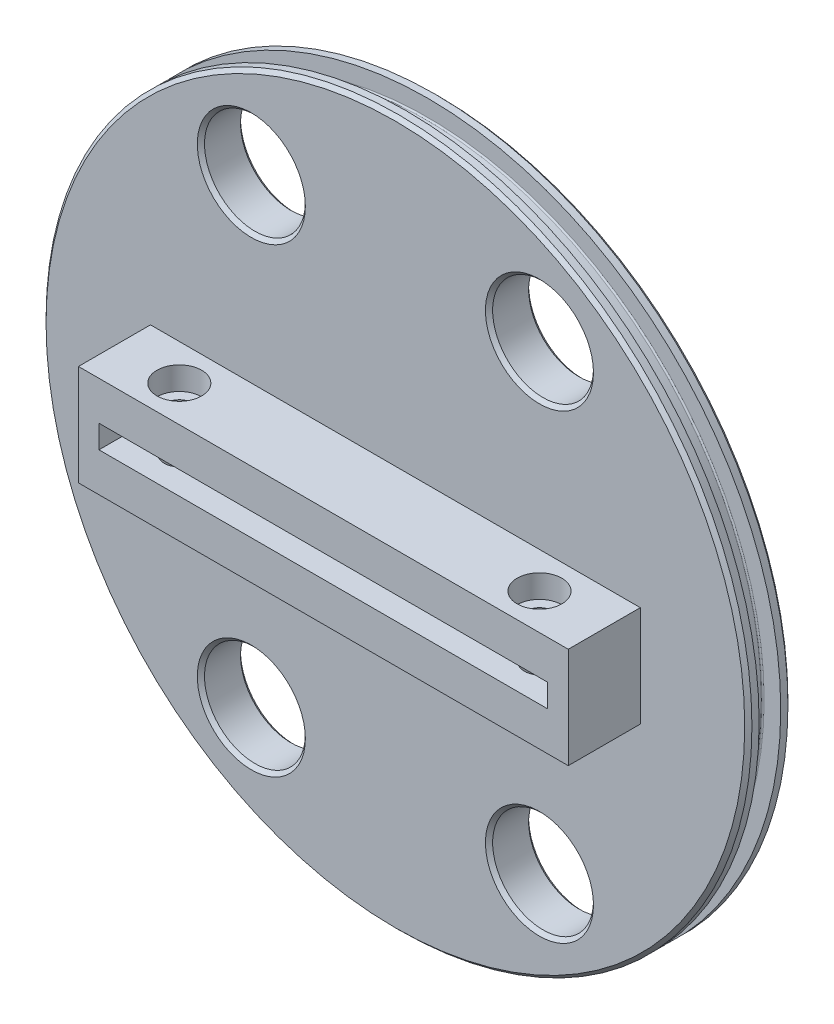
ISO-10303-21;
HEADER;
FILE_DESCRIPTION(('STEP AP214'),'2;1');
FILE_NAME('part.step','',(''),(''),'','','');
FILE_SCHEMA(('AUTOMOTIVE_DESIGN { 1 0 10303 214 1 1 1 1 }'));
ENDSEC;
DATA;
#1=APPLICATION_CONTEXT('core data for automotive mechanical design processes');
#2=APPLICATION_PROTOCOL_DEFINITION('international standard','automotive_design',2000,#1);
#3=PRODUCT_CONTEXT('',#1,'mechanical');
#4=PRODUCT('Part','Part','',(#3));
#5=PRODUCT_RELATED_PRODUCT_CATEGORY('part','',(#4));
#6=PRODUCT_DEFINITION_FORMATION('','',#4);
#7=PRODUCT_DEFINITION_CONTEXT('part definition',#1,'design');
#8=PRODUCT_DEFINITION('design','',#6,#7);
#9=PRODUCT_DEFINITION_SHAPE('','',#8);
#10=(LENGTH_UNIT() NAMED_UNIT(*) SI_UNIT(.MILLI.,.METRE.));
#11=(NAMED_UNIT(*) PLANE_ANGLE_UNIT() SI_UNIT($,.RADIAN.));
#12=(NAMED_UNIT(*) SI_UNIT($,.STERADIAN.) SOLID_ANGLE_UNIT());
#13=UNCERTAINTY_MEASURE_WITH_UNIT(LENGTH_MEASURE(1.E-05),#10,'distance_accuracy_value','');
#14=(GEOMETRIC_REPRESENTATION_CONTEXT(3) GLOBAL_UNCERTAINTY_ASSIGNED_CONTEXT((#13)) GLOBAL_UNIT_ASSIGNED_CONTEXT((#10,
#11,#12)) REPRESENTATION_CONTEXT('',''));
#15=CARTESIAN_POINT('',(0.,0.,0.));
#16=DIRECTION('',(0.,0.,1.));
#17=DIRECTION('',(1.,0.,0.));
#18=AXIS2_PLACEMENT_3D('',#15,#16,#17);
#19=CARTESIAN_POINT('',(-34.,7.,16.));
#20=DIRECTION('',(0.,-1.,0.));
#21=DIRECTION('',(0.,0.,-1.));
#22=AXIS2_PLACEMENT_3D('',#19,#20,#21);
#23=PLANE('',#22);
#24=DIRECTION('',(-1.,0.,0.));
#25=VECTOR('',#24,1.);
#26=CARTESIAN_POINT('',(-34.,7.,6.));
#27=LINE('',#26,#25);
#28=CARTESIAN_POINT('',(34.,7.,6.));
#29=VERTEX_POINT('',#28);
#30=CARTESIAN_POINT('',(-34.,7.,6.));
#31=VERTEX_POINT('',#30);
#32=EDGE_CURVE('E163',#29,#31,#27,.T.);
#33=ORIENTED_EDGE('',*,*,#32,.T.);
#34=DIRECTION('',(0.,0.,-1.));
#35=VECTOR('',#34,1.);
#36=CARTESIAN_POINT('',(-34.,7.,16.));
#37=LINE('',#36,#35);
#38=CARTESIAN_POINT('',(-34.,7.,16.));
#39=VERTEX_POINT('',#38);
#40=EDGE_CURVE('E175',#39,#31,#37,.T.);
#41=ORIENTED_EDGE('',*,*,#40,.F.);
#42=DIRECTION('',(-1.,0.,0.));
#43=VECTOR('',#42,1.);
#44=CARTESIAN_POINT('',(-34.,7.,16.));
#45=LINE('',#44,#43);
#46=CARTESIAN_POINT('',(34.,7.,16.));
#47=VERTEX_POINT('',#46);
#48=EDGE_CURVE('E154',#47,#39,#45,.T.);
#49=ORIENTED_EDGE('',*,*,#48,.F.);
#50=DIRECTION('',(0.,0.,-1.));
#51=VECTOR('',#50,1.);
#52=CARTESIAN_POINT('',(34.,7.,16.));
#53=LINE('',#52,#51);
#54=EDGE_CURVE('E178',#47,#29,#53,.T.);
#55=ORIENTED_EDGE('',*,*,#54,.T.);
#56=EDGE_LOOP('',(#33,#41,#49,#55));
#57=FACE_BOUND('',#56,.T.);
#58=CARTESIAN_POINT('',(25.,7.,11.));
#59=DIRECTION('',(0.,1.,0.));
#60=DIRECTION('',(0.,0.,1.));
#61=AXIS2_PLACEMENT_3D('',#58,#59,#60);
#62=CIRCLE('',#61,3.1);
#63=CARTESIAN_POINT('',(25.,7.,14.1));
#64=VERTEX_POINT('',#63);
#65=EDGE_CURVE('E489',#64,#64,#62,.T.);
#66=ORIENTED_EDGE('',*,*,#65,.F.);
#67=EDGE_LOOP('',(#66));
#68=FACE_BOUND('',#67,.T.);
#69=CARTESIAN_POINT('',(-25.,7.,11.));
#70=DIRECTION('',(0.,1.,0.));
#71=DIRECTION('',(0.,0.,1.));
#72=AXIS2_PLACEMENT_3D('',#69,#70,#71);
#73=CIRCLE('',#72,3.1);
#74=CARTESIAN_POINT('',(-25.,7.,14.1));
#75=VERTEX_POINT('',#74);
#76=EDGE_CURVE('E479',#75,#75,#73,.T.);
#77=ORIENTED_EDGE('',*,*,#76,.F.);
#78=EDGE_LOOP('',(#77));
#79=FACE_BOUND('',#78,.T.);
#80=ADVANCED_FACE('F43',(#57,#68,#79),#23,.F.);
#81=CARTESIAN_POINT('',(0.,0.,6.));
#82=DIRECTION('',(0.,0.,-1.));
#83=DIRECTION('',(-1.,0.,0.));
#84=AXIS2_PLACEMENT_3D('',#81,#82,#83);
#85=CYLINDRICAL_SURFACE('',#84,49.);
#86=CARTESIAN_POINT('',(0.,0.,5.49999999999997));
#87=DIRECTION('',(0.,0.,1.));
#88=DIRECTION('',(1.,0.,0.));
#89=AXIS2_PLACEMENT_3D('',#86,#87,#88);
#90=CIRCLE('',#89,49.);
#91=CARTESIAN_POINT('',(49.,0.,5.49999999999997));
#92=VERTEX_POINT('',#91);
#93=EDGE_CURVE('E11',#92,#92,#90,.F.);
#94=ORIENTED_EDGE('',*,*,#93,.T.);
#95=EDGE_LOOP('',(#94));
#96=FACE_BOUND('',#95,.T.);
#97=CARTESIAN_POINT('',(0.,0.,4.5));
#98=DIRECTION('',(0.,0.,-1.));
#99=DIRECTION('',(-1.,0.,0.));
#100=AXIS2_PLACEMENT_3D('',#97,#98,#99);
#101=CIRCLE('',#100,49.);
#102=CARTESIAN_POINT('',(-49.,0.,4.5));
#103=VERTEX_POINT('',#102);
#104=EDGE_CURVE('E182',#103,#103,#101,.T.);
#105=ORIENTED_EDGE('',*,*,#104,.F.);
#106=EDGE_LOOP('',(#105));
#107=FACE_BOUND('',#106,.T.);
#108=ADVANCED_FACE('F273',(#96,#107),#85,.T.);
#109=CARTESIAN_POINT('',(0.,0.,6.));
#110=DIRECTION('',(0.,0.,1.));
#111=DIRECTION('',(1.,0.,0.));
#112=AXIS2_PLACEMENT_3D('',#109,#110,#111);
#113=PLANE('',#112);
#114=CARTESIAN_POINT('',(20.,-32.,6.));
#115=DIRECTION('',(0.,0.,1.));
#116=DIRECTION('',(1.,0.,0.));
#117=AXIS2_PLACEMENT_3D('',#114,#115,#116);
#118=CIRCLE('',#117,7.49999999999999);
#119=CARTESIAN_POINT('',(27.5,-32.,6.));
#120=VERTEX_POINT('',#119);
#121=EDGE_CURVE('E211',#120,#120,#118,.F.);
#122=ORIENTED_EDGE('',*,*,#121,.T.);
#123=EDGE_LOOP('',(#122));
#124=FACE_BOUND('',#123,.T.);
#125=CARTESIAN_POINT('',(-20.,-32.,6.));
#126=DIRECTION('',(0.,0.,1.));
#127=DIRECTION('',(1.,0.,0.));
#128=AXIS2_PLACEMENT_3D('',#125,#126,#127);
#129=CIRCLE('',#128,7.50000000000003);
#130=CARTESIAN_POINT('',(-12.5,-32.,6.));
#131=VERTEX_POINT('',#130);
#132=EDGE_CURVE('E208',#131,#131,#129,.F.);
#133=ORIENTED_EDGE('',*,*,#132,.T.);
#134=EDGE_LOOP('',(#133));
#135=FACE_BOUND('',#134,.T.);
#136=CARTESIAN_POINT('',(-20.,32.,6.));
#137=DIRECTION('',(0.,0.,1.));
#138=DIRECTION('',(1.,0.,0.));
#139=AXIS2_PLACEMENT_3D('',#136,#137,#138);
#140=CIRCLE('',#139,7.50000000000003);
#141=CARTESIAN_POINT('',(-12.5,32.,6.));
#142=VERTEX_POINT('',#141);
#143=EDGE_CURVE('E205',#142,#142,#140,.F.);
#144=ORIENTED_EDGE('',*,*,#143,.T.);
#145=EDGE_LOOP('',(#144));
#146=FACE_BOUND('',#145,.T.);
#147=CARTESIAN_POINT('',(20.,32.,6.));
#148=DIRECTION('',(0.,0.,1.));
#149=DIRECTION('',(1.,0.,0.));
#150=AXIS2_PLACEMENT_3D('',#147,#148,#149);
#151=CIRCLE('',#150,7.49999999999999);
#152=CARTESIAN_POINT('',(27.5,32.,6.));
#153=VERTEX_POINT('',#152);
#154=EDGE_CURVE('E202',#153,#153,#151,.F.);
#155=ORIENTED_EDGE('',*,*,#154,.T.);
#156=EDGE_LOOP('',(#155));
#157=FACE_BOUND('',#156,.T.);
#158=CARTESIAN_POINT('',(0.,0.,6.));
#159=DIRECTION('',(0.,0.,1.));
#160=DIRECTION('',(1.,0.,0.));
#161=AXIS2_PLACEMENT_3D('',#158,#159,#160);
#162=CIRCLE('',#161,48.5);
#163=CARTESIAN_POINT('',(48.5,0.,6.));
#164=VERTEX_POINT('',#163);
#165=EDGE_CURVE('E199',#164,#164,#162,.T.);
#166=ORIENTED_EDGE('',*,*,#165,.T.);
#167=EDGE_LOOP('',(#166));
#168=FACE_BOUND('',#167,.T.);
#169=DIRECTION('',(0.,1.,0.));
#170=VECTOR('',#169,1.);
#171=CARTESIAN_POINT('',(34.,7.,6.));
#172=LINE('',#171,#170);
#173=CARTESIAN_POINT('',(34.,-7.,6.));
#174=VERTEX_POINT('',#173);
#175=EDGE_CURVE('E67',#174,#29,#172,.T.);
#176=ORIENTED_EDGE('',*,*,#175,.F.);
#177=DIRECTION('',(1.,0.,0.));
#178=VECTOR('',#177,1.);
#179=CARTESIAN_POINT('',(-34.,-7.,6.));
#180=LINE('',#179,#178);
#181=CARTESIAN_POINT('',(-34.,-7.,6.));
#182=VERTEX_POINT('',#181);
#183=EDGE_CURVE('E155',#182,#174,#180,.T.);
#184=ORIENTED_EDGE('',*,*,#183,.F.);
#185=DIRECTION('',(0.,-1.,0.));
#186=VECTOR('',#185,1.);
#187=CARTESIAN_POINT('',(-34.,7.,6.));
#188=LINE('',#187,#186);
#189=EDGE_CURVE('E166',#31,#182,#188,.T.);
#190=ORIENTED_EDGE('',*,*,#189,.F.);
#191=ORIENTED_EDGE('',*,*,#32,.F.);
#192=EDGE_LOOP('',(#176,#184,#190,#191));
#193=FACE_BOUND('',#192,.T.);
#194=ADVANCED_FACE('F281',(#124,#135,#146,#157,#168,#193),#113,.T.);
#195=CARTESIAN_POINT('',(34.,7.,16.));
#196=DIRECTION('',(-1.,0.,0.));
#197=DIRECTION('',(0.,0.,1.));
#198=AXIS2_PLACEMENT_3D('',#195,#196,#197);
#199=PLANE('',#198);
#200=ORIENTED_EDGE('',*,*,#175,.T.);
#201=ORIENTED_EDGE('',*,*,#54,.F.);
#202=DIRECTION('',(0.,1.,0.));
#203=VECTOR('',#202,1.);
#204=CARTESIAN_POINT('',(34.,7.,16.));
#205=LINE('',#204,#203);
#206=CARTESIAN_POINT('',(34.,-7.,16.));
#207=VERTEX_POINT('',#206);
#208=EDGE_CURVE('E151',#207,#47,#205,.T.);
#209=ORIENTED_EDGE('',*,*,#208,.F.);
#210=DIRECTION('',(0.,0.,-1.));
#211=VECTOR('',#210,1.);
#212=CARTESIAN_POINT('',(34.,-7.,16.));
#213=LINE('',#212,#211);
#214=EDGE_CURVE('E161',#207,#174,#213,.T.);
#215=ORIENTED_EDGE('',*,*,#214,.T.);
#216=EDGE_LOOP('',(#200,#201,#209,#215));
#217=FACE_BOUND('',#216,.T.);
#218=ADVANCED_FACE('F289',(#217),#199,.F.);
#219=CARTESIAN_POINT('',(-34.,7.,16.));
#220=DIRECTION('',(1.,0.,0.));
#221=DIRECTION('',(0.,0.,-1.));
#222=AXIS2_PLACEMENT_3D('',#219,#220,#221);
#223=PLANE('',#222);
#224=ORIENTED_EDGE('',*,*,#189,.T.);
#225=DIRECTION('',(0.,0.,-1.));
#226=VECTOR('',#225,1.);
#227=CARTESIAN_POINT('',(-34.,-7.,16.));
#228=LINE('',#227,#226);
#229=CARTESIAN_POINT('',(-34.,-7.,16.));
#230=VERTEX_POINT('',#229);
#231=EDGE_CURVE('E172',#230,#182,#228,.T.);
#232=ORIENTED_EDGE('',*,*,#231,.F.);
#233=DIRECTION('',(0.,-1.,0.));
#234=VECTOR('',#233,1.);
#235=CARTESIAN_POINT('',(-34.,7.,16.));
#236=LINE('',#235,#234);
#237=EDGE_CURVE('E157',#39,#230,#236,.T.);
#238=ORIENTED_EDGE('',*,*,#237,.F.);
#239=ORIENTED_EDGE('',*,*,#40,.T.);
#240=EDGE_LOOP('',(#224,#232,#238,#239));
#241=FACE_BOUND('',#240,.T.);
#242=ADVANCED_FACE('F287',(#241),#223,.F.);
#243=CARTESIAN_POINT('',(-34.,-7.,16.));
#244=DIRECTION('',(0.,1.,0.));
#245=DIRECTION('',(0.,0.,1.));
#246=AXIS2_PLACEMENT_3D('',#243,#244,#245);
#247=PLANE('',#246);
#248=CARTESIAN_POINT('',(-25.,-7.,11.));
#249=DIRECTION('',(0.,1.,0.));
#250=DIRECTION('',(0.,0.,1.));
#251=AXIS2_PLACEMENT_3D('',#248,#249,#250);
#252=CIRCLE('',#251,2.1);
#253=CARTESIAN_POINT('',(-25.,-7.,13.1));
#254=VERTEX_POINT('',#253);
#255=EDGE_CURVE('E463',#254,#254,#252,.T.);
#256=ORIENTED_EDGE('',*,*,#255,.T.);
#257=EDGE_LOOP('',(#256));
#258=FACE_BOUND('',#257,.T.);
#259=CARTESIAN_POINT('',(25.,-7.,11.));
#260=DIRECTION('',(0.,1.,0.));
#261=DIRECTION('',(0.,0.,1.));
#262=AXIS2_PLACEMENT_3D('',#259,#260,#261);
#263=CIRCLE('',#262,2.1);
#264=CARTESIAN_POINT('',(25.,-7.,13.1));
#265=VERTEX_POINT('',#264);
#266=EDGE_CURVE('E467',#265,#265,#263,.T.);
#267=ORIENTED_EDGE('',*,*,#266,.T.);
#268=EDGE_LOOP('',(#267));
#269=FACE_BOUND('',#268,.T.);
#270=ORIENTED_EDGE('',*,*,#183,.T.);
#271=ORIENTED_EDGE('',*,*,#214,.F.);
#272=DIRECTION('',(1.,0.,0.));
#273=VECTOR('',#272,1.);
#274=CARTESIAN_POINT('',(-34.,-7.,16.));
#275=LINE('',#274,#273);
#276=EDGE_CURVE('E159',#230,#207,#275,.T.);
#277=ORIENTED_EDGE('',*,*,#276,.F.);
#278=ORIENTED_EDGE('',*,*,#231,.T.);
#279=EDGE_LOOP('',(#270,#271,#277,#278));
#280=FACE_BOUND('',#279,.T.);
#281=ADVANCED_FACE('F452',(#258,#269,#280),#247,.F.);
#282=CARTESIAN_POINT('',(0.,0.,16.));
#283=DIRECTION('',(0.,0.,1.));
#284=DIRECTION('',(1.,0.,0.));
#285=AXIS2_PLACEMENT_3D('',#282,#283,#284);
#286=PLANE('',#285);
#287=DIRECTION('',(0.,1.,0.));
#288=VECTOR('',#287,1.);
#289=CARTESIAN_POINT('',(31.15,1.6,16.));
#290=LINE('',#289,#288);
#291=CARTESIAN_POINT('',(31.15,-1.6,16.));
#292=VERTEX_POINT('',#291);
#293=CARTESIAN_POINT('',(31.15,1.6,16.));
#294=VERTEX_POINT('',#293);
#295=EDGE_CURVE('E59',#292,#294,#290,.T.);
#296=ORIENTED_EDGE('',*,*,#295,.F.);
#297=DIRECTION('',(1.,0.,0.));
#298=VECTOR('',#297,1.);
#299=CARTESIAN_POINT('',(-31.15,-1.6,16.));
#300=LINE('',#299,#298);
#301=CARTESIAN_POINT('',(-31.15,-1.6,16.));
#302=VERTEX_POINT('',#301);
#303=EDGE_CURVE('E129',#302,#292,#300,.T.);
#304=ORIENTED_EDGE('',*,*,#303,.F.);
#305=DIRECTION('',(0.,-1.,0.));
#306=VECTOR('',#305,1.);
#307=CARTESIAN_POINT('',(-31.15,1.6,16.));
#308=LINE('',#307,#306);
#309=CARTESIAN_POINT('',(-31.15,1.6,16.));
#310=VERTEX_POINT('',#309);
#311=EDGE_CURVE('E132',#310,#302,#308,.T.);
#312=ORIENTED_EDGE('',*,*,#311,.F.);
#313=DIRECTION('',(-1.,0.,0.));
#314=VECTOR('',#313,1.);
#315=CARTESIAN_POINT('',(-31.15,1.6,16.));
#316=LINE('',#315,#314);
#317=EDGE_CURVE('E141',#294,#310,#316,.T.);
#318=ORIENTED_EDGE('',*,*,#317,.F.);
#319=EDGE_LOOP('',(#296,#304,#312,#318));
#320=FACE_BOUND('',#319,.T.);
#321=ORIENTED_EDGE('',*,*,#208,.T.);
#322=ORIENTED_EDGE('',*,*,#48,.T.);
#323=ORIENTED_EDGE('',*,*,#237,.T.);
#324=ORIENTED_EDGE('',*,*,#276,.T.);
#325=EDGE_LOOP('',(#321,#322,#323,#324));
#326=FACE_BOUND('',#325,.T.);
#327=ADVANCED_FACE('F450',(#320,#326),#286,.T.);
#328=CARTESIAN_POINT('',(31.15,1.6,6.));
#329=DIRECTION('',(1.,0.,0.));
#330=DIRECTION('',(0.,0.,-1.));
#331=AXIS2_PLACEMENT_3D('',#328,#329,#330);
#332=PLANE('',#331);
#333=ORIENTED_EDGE('',*,*,#295,.T.);
#334=DIRECTION('',(0.,0.,1.));
#335=VECTOR('',#334,1.);
#336=CARTESIAN_POINT('',(31.15,1.6,6.));
#337=LINE('',#336,#335);
#338=CARTESIAN_POINT('',(31.15,1.6,6.));
#339=VERTEX_POINT('',#338);
#340=EDGE_CURVE('E107',#339,#294,#337,.T.);
#341=ORIENTED_EDGE('',*,*,#340,.F.);
#342=DIRECTION('',(0.,1.,0.));
#343=VECTOR('',#342,1.);
#344=CARTESIAN_POINT('',(31.15,1.6,6.));
#345=LINE('',#344,#343);
#346=CARTESIAN_POINT('',(31.15,-1.6,6.));
#347=VERTEX_POINT('',#346);
#348=EDGE_CURVE('E111',#347,#339,#345,.T.);
#349=ORIENTED_EDGE('',*,*,#348,.F.);
#350=DIRECTION('',(0.,0.,1.));
#351=VECTOR('',#350,1.);
#352=CARTESIAN_POINT('',(31.15,-1.6,6.));
#353=LINE('',#352,#351);
#354=EDGE_CURVE('E146',#347,#292,#353,.T.);
#355=ORIENTED_EDGE('',*,*,#354,.T.);
#356=EDGE_LOOP('',(#333,#341,#349,#355));
#357=FACE_BOUND('',#356,.T.);
#358=ADVANCED_FACE('F109',(#357),#332,.F.);
#359=CARTESIAN_POINT('',(-31.15,-1.6,6.));
#360=DIRECTION('',(0.,-1.,0.));
#361=DIRECTION('',(0.,0.,-1.));
#362=AXIS2_PLACEMENT_3D('',#359,#360,#361);
#363=PLANE('',#362);
#364=CARTESIAN_POINT('',(-25.,-1.6,11.));
#365=DIRECTION('',(0.,1.,0.));
#366=DIRECTION('',(0.,0.,1.));
#367=AXIS2_PLACEMENT_3D('',#364,#365,#366);
#368=CIRCLE('',#367,2.1);
#369=CARTESIAN_POINT('',(-25.,-1.6,13.1));
#370=VERTEX_POINT('',#369);
#371=EDGE_CURVE('E477',#370,#370,#368,.T.);
#372=ORIENTED_EDGE('',*,*,#371,.F.);
#373=EDGE_LOOP('',(#372));
#374=FACE_BOUND('',#373,.T.);
#375=CARTESIAN_POINT('',(25.,-1.6,11.));
#376=DIRECTION('',(0.,1.,0.));
#377=DIRECTION('',(0.,0.,1.));
#378=AXIS2_PLACEMENT_3D('',#375,#376,#377);
#379=CIRCLE('',#378,2.1);
#380=CARTESIAN_POINT('',(25.,-1.6,13.1));
#381=VERTEX_POINT('',#380);
#382=EDGE_CURVE('E482',#381,#381,#379,.T.);
#383=ORIENTED_EDGE('',*,*,#382,.F.);
#384=EDGE_LOOP('',(#383));
#385=FACE_BOUND('',#384,.T.);
#386=ORIENTED_EDGE('',*,*,#303,.T.);
#387=ORIENTED_EDGE('',*,*,#354,.F.);
#388=DIRECTION('',(1.,0.,0.));
#389=VECTOR('',#388,1.);
#390=CARTESIAN_POINT('',(-31.15,-1.6,6.));
#391=LINE('',#390,#389);
#392=CARTESIAN_POINT('',(-31.15,-1.6,6.));
#393=VERTEX_POINT('',#392);
#394=EDGE_CURVE('E117',#393,#347,#391,.T.);
#395=ORIENTED_EDGE('',*,*,#394,.F.);
#396=DIRECTION('',(0.,0.,1.));
#397=VECTOR('',#396,1.);
#398=CARTESIAN_POINT('',(-31.15,-1.6,6.));
#399=LINE('',#398,#397);
#400=EDGE_CURVE('E148',#393,#302,#399,.T.);
#401=ORIENTED_EDGE('',*,*,#400,.T.);
#402=EDGE_LOOP('',(#386,#387,#395,#401));
#403=FACE_BOUND('',#402,.T.);
#404=ADVANCED_FACE('F438',(#374,#385,#403),#363,.F.);
#405=CARTESIAN_POINT('',(-31.15,1.6,6.));
#406=DIRECTION('',(-1.,0.,0.));
#407=DIRECTION('',(0.,0.,1.));
#408=AXIS2_PLACEMENT_3D('',#405,#406,#407);
#409=PLANE('',#408);
#410=ORIENTED_EDGE('',*,*,#311,.T.);
#411=ORIENTED_EDGE('',*,*,#400,.F.);
#412=DIRECTION('',(0.,-1.,0.));
#413=VECTOR('',#412,1.);
#414=CARTESIAN_POINT('',(-31.15,1.6,6.));
#415=LINE('',#414,#413);
#416=CARTESIAN_POINT('',(-31.15,1.6,6.));
#417=VERTEX_POINT('',#416);
#418=EDGE_CURVE('E125',#417,#393,#415,.T.);
#419=ORIENTED_EDGE('',*,*,#418,.F.);
#420=DIRECTION('',(0.,0.,1.));
#421=VECTOR('',#420,1.);
#422=CARTESIAN_POINT('',(-31.15,1.6,6.));
#423=LINE('',#422,#421);
#424=EDGE_CURVE('E116',#417,#310,#423,.T.);
#425=ORIENTED_EDGE('',*,*,#424,.T.);
#426=EDGE_LOOP('',(#410,#411,#419,#425));
#427=FACE_BOUND('',#426,.T.);
#428=ADVANCED_FACE('F441',(#427),#409,.F.);
#429=CARTESIAN_POINT('',(-31.15,1.6,6.));
#430=DIRECTION('',(0.,1.,0.));
#431=DIRECTION('',(0.,0.,1.));
#432=AXIS2_PLACEMENT_3D('',#429,#430,#431);
#433=PLANE('',#432);
#434=CARTESIAN_POINT('',(-25.,1.6,11.));
#435=DIRECTION('',(0.,1.,0.));
#436=DIRECTION('',(0.,0.,1.));
#437=AXIS2_PLACEMENT_3D('',#434,#435,#436);
#438=CIRCLE('',#437,1.7);
#439=CARTESIAN_POINT('',(-25.,1.6,12.7));
#440=VERTEX_POINT('',#439);
#441=EDGE_CURVE('E486',#440,#440,#438,.F.);
#442=ORIENTED_EDGE('',*,*,#441,.F.);
#443=EDGE_LOOP('',(#442));
#444=FACE_BOUND('',#443,.T.);
#445=CARTESIAN_POINT('',(25.,1.6,11.));
#446=DIRECTION('',(0.,1.,0.));
#447=DIRECTION('',(0.,0.,1.));
#448=AXIS2_PLACEMENT_3D('',#445,#446,#447);
#449=CIRCLE('',#448,1.7);
#450=CARTESIAN_POINT('',(25.,1.6,12.7));
#451=VERTEX_POINT('',#450);
#452=EDGE_CURVE('E185',#451,#451,#449,.F.);
#453=ORIENTED_EDGE('',*,*,#452,.F.);
#454=EDGE_LOOP('',(#453));
#455=FACE_BOUND('',#454,.T.);
#456=ORIENTED_EDGE('',*,*,#317,.T.);
#457=ORIENTED_EDGE('',*,*,#424,.F.);
#458=DIRECTION('',(-1.,0.,0.));
#459=VECTOR('',#458,1.);
#460=CARTESIAN_POINT('',(-31.15,1.6,6.));
#461=LINE('',#460,#459);
#462=EDGE_CURVE('E120',#339,#417,#461,.T.);
#463=ORIENTED_EDGE('',*,*,#462,.F.);
#464=ORIENTED_EDGE('',*,*,#340,.T.);
#465=EDGE_LOOP('',(#456,#457,#463,#464));
#466=FACE_BOUND('',#465,.T.);
#467=ADVANCED_FACE('F121',(#444,#455,#466),#433,.F.);
#468=CARTESIAN_POINT('',(0.,0.,6.));
#469=DIRECTION('',(0.,0.,1.));
#470=DIRECTION('',(1.,0.,0.));
#471=AXIS2_PLACEMENT_3D('',#468,#469,#470);
#472=PLANE('',#471);
#473=ORIENTED_EDGE('',*,*,#348,.T.);
#474=ORIENTED_EDGE('',*,*,#462,.T.);
#475=ORIENTED_EDGE('',*,*,#418,.T.);
#476=ORIENTED_EDGE('',*,*,#394,.T.);
#477=EDGE_LOOP('',(#473,#474,#475,#476));
#478=FACE_BOUND('',#477,.T.);
#479=ADVANCED_FACE('F127',(#478),#472,.T.);
#480=CARTESIAN_POINT('',(0.,52.,1.5));
#481=DIRECTION('',(0.,0.,1.));
#482=DIRECTION('',(1.,0.,0.));
#483=AXIS2_PLACEMENT_3D('',#480,#481,#482);
#484=PLANE('',#483);
#485=CARTESIAN_POINT('',(0.,0.,1.5));
#486=DIRECTION('',(0.,0.,1.));
#487=DIRECTION('',(1.,0.,0.));
#488=AXIS2_PLACEMENT_3D('',#485,#486,#487);
#489=CIRCLE('',#488,46.7);
#490=CARTESIAN_POINT('',(46.7,0.,1.5));
#491=VERTEX_POINT('',#490);
#492=EDGE_CURVE('E193',#491,#491,#489,.F.);
#493=ORIENTED_EDGE('',*,*,#492,.T.);
#494=EDGE_LOOP('',(#493));
#495=FACE_BOUND('',#494,.T.);
#496=CARTESIAN_POINT('',(0.,0.,1.5));
#497=DIRECTION('',(0.,0.,1.));
#498=DIRECTION('',(1.,0.,0.));
#499=AXIS2_PLACEMENT_3D('',#496,#497,#498);
#500=CIRCLE('',#499,49.);
#501=CARTESIAN_POINT('',(49.,0.,1.5));
#502=VERTEX_POINT('',#501);
#503=EDGE_CURVE('E142',#502,#502,#500,.T.);
#504=ORIENTED_EDGE('',*,*,#503,.T.);
#505=EDGE_LOOP('',(#504));
#506=FACE_BOUND('',#505,.T.);
#507=ADVANCED_FACE('F431',(#495,#506),#484,.T.);
#508=CARTESIAN_POINT('',(0.,52.,4.5));
#509=DIRECTION('',(0.,0.,-1.));
#510=DIRECTION('',(-1.,0.,0.));
#511=AXIS2_PLACEMENT_3D('',#508,#509,#510);
#512=PLANE('',#511);
#513=CARTESIAN_POINT('',(0.,0.,4.5));
#514=DIRECTION('',(0.,0.,-1.));
#515=DIRECTION('',(-1.,0.,0.));
#516=AXIS2_PLACEMENT_3D('',#513,#514,#515);
#517=CIRCLE('',#516,46.7);
#518=CARTESIAN_POINT('',(-46.7,0.,4.5));
#519=VERTEX_POINT('',#518);
#520=EDGE_CURVE('E196',#519,#519,#517,.F.);
#521=ORIENTED_EDGE('',*,*,#520,.T.);
#522=EDGE_LOOP('',(#521));
#523=FACE_BOUND('',#522,.T.);
#524=ORIENTED_EDGE('',*,*,#104,.T.);
#525=EDGE_LOOP('',(#524));
#526=FACE_BOUND('',#525,.T.);
#527=ADVANCED_FACE('F427',(#523,#526),#512,.T.);
#528=CARTESIAN_POINT('',(0.,0.,6.));
#529=DIRECTION('',(0.,0.,1.));
#530=DIRECTION('',(1.,0.,0.));
#531=AXIS2_PLACEMENT_3D('',#528,#529,#530);
#532=CYLINDRICAL_SURFACE('',#531,46.5);
#533=CARTESIAN_POINT('',(0.,0.,1.7));
#534=DIRECTION('',(0.,0.,1.));
#535=DIRECTION('',(1.,0.,0.));
#536=AXIS2_PLACEMENT_3D('',#533,#534,#535);
#537=CIRCLE('',#536,46.5);
#538=CARTESIAN_POINT('',(46.5,0.,1.7));
#539=VERTEX_POINT('',#538);
#540=EDGE_CURVE('E190',#539,#539,#537,.T.);
#541=ORIENTED_EDGE('',*,*,#540,.T.);
#542=EDGE_LOOP('',(#541));
#543=FACE_BOUND('',#542,.T.);
#544=CARTESIAN_POINT('',(0.,0.,4.3));
#545=DIRECTION('',(0.,0.,-1.));
#546=DIRECTION('',(-1.,0.,0.));
#547=AXIS2_PLACEMENT_3D('',#544,#545,#546);
#548=CIRCLE('',#547,46.5);
#549=CARTESIAN_POINT('',(-46.5,0.,4.3));
#550=VERTEX_POINT('',#549);
#551=EDGE_CURVE('E181',#550,#550,#548,.T.);
#552=ORIENTED_EDGE('',*,*,#551,.T.);
#553=EDGE_LOOP('',(#552));
#554=FACE_BOUND('',#553,.T.);
#555=ADVANCED_FACE('F298',(#543,#554),#532,.T.);
#556=CARTESIAN_POINT('',(0.,0.,0.));
#557=DIRECTION('',(0.,0.,1.));
#558=DIRECTION('',(1.,0.,0.));
#559=AXIS2_PLACEMENT_3D('',#556,#557,#558);
#560=PLANE('',#559);
#561=CARTESIAN_POINT('',(20.,-32.,0.));
#562=DIRECTION('',(0.,0.,1.));
#563=DIRECTION('',(1.,0.,0.));
#564=AXIS2_PLACEMENT_3D('',#561,#562,#563);
#565=CIRCLE('',#564,7.50000000000002);
#566=CARTESIAN_POINT('',(27.5,-32.,0.));
#567=VERTEX_POINT('',#566);
#568=EDGE_CURVE('E232',#567,#567,#565,.T.);
#569=ORIENTED_EDGE('',*,*,#568,.T.);
#570=EDGE_LOOP('',(#569));
#571=FACE_BOUND('',#570,.T.);
#572=CARTESIAN_POINT('',(-20.,-32.,0.));
#573=DIRECTION('',(0.,0.,1.));
#574=DIRECTION('',(1.,0.,0.));
#575=AXIS2_PLACEMENT_3D('',#572,#573,#574);
#576=CIRCLE('',#575,7.50000000000002);
#577=CARTESIAN_POINT('',(-12.5,-32.,0.));
#578=VERTEX_POINT('',#577);
#579=EDGE_CURVE('E229',#578,#578,#576,.T.);
#580=ORIENTED_EDGE('',*,*,#579,.T.);
#581=EDGE_LOOP('',(#580));
#582=FACE_BOUND('',#581,.T.);
#583=CARTESIAN_POINT('',(-20.,32.,0.));
#584=DIRECTION('',(0.,0.,1.));
#585=DIRECTION('',(1.,0.,0.));
#586=AXIS2_PLACEMENT_3D('',#583,#584,#585);
#587=CIRCLE('',#586,7.49999999999998);
#588=CARTESIAN_POINT('',(-12.5,32.,0.));
#589=VERTEX_POINT('',#588);
#590=EDGE_CURVE('E226',#589,#589,#587,.T.);
#591=ORIENTED_EDGE('',*,*,#590,.T.);
#592=EDGE_LOOP('',(#591));
#593=FACE_BOUND('',#592,.T.);
#594=CARTESIAN_POINT('',(20.,32.,0.));
#595=DIRECTION('',(0.,0.,1.));
#596=DIRECTION('',(1.,0.,0.));
#597=AXIS2_PLACEMENT_3D('',#594,#595,#596);
#598=CIRCLE('',#597,7.49999999999998);
#599=CARTESIAN_POINT('',(27.5,32.,0.));
#600=VERTEX_POINT('',#599);
#601=EDGE_CURVE('E223',#600,#600,#598,.T.);
#602=ORIENTED_EDGE('',*,*,#601,.T.);
#603=EDGE_LOOP('',(#602));
#604=FACE_BOUND('',#603,.T.);
#605=CARTESIAN_POINT('',(0.,0.,0.));
#606=DIRECTION('',(0.,0.,1.));
#607=DIRECTION('',(1.,0.,0.));
#608=AXIS2_PLACEMENT_3D('',#605,#606,#607);
#609=CIRCLE('',#608,48.5);
#610=CARTESIAN_POINT('',(48.5,0.,0.));
#611=VERTEX_POINT('',#610);
#612=EDGE_CURVE('E220',#611,#611,#609,.F.);
#613=ORIENTED_EDGE('',*,*,#612,.T.);
#614=EDGE_LOOP('',(#613));
#615=FACE_BOUND('',#614,.T.);
#616=ADVANCED_FACE('F296',(#571,#582,#593,#604,#615),#560,.F.);
#617=CARTESIAN_POINT('',(0.,0.,0.500000000000007));
#618=DIRECTION('',(0.,0.,1.));
#619=DIRECTION('',(1.,0.,0.));
#620=AXIS2_PLACEMENT_3D('',#617,#618,#619);
#621=CIRCLE('',#620,49.);
#622=CARTESIAN_POINT('',(49.,0.,0.500000000000007));
#623=VERTEX_POINT('',#622);
#624=EDGE_CURVE('E52',#623,#623,#621,.T.);
#625=ORIENTED_EDGE('',*,*,#624,.T.);
#626=EDGE_LOOP('',(#625));
#627=FACE_BOUND('',#626,.T.);
#628=ORIENTED_EDGE('',*,*,#503,.F.);
#629=EDGE_LOOP('',(#628));
#630=FACE_BOUND('',#629,.T.);
#631=ADVANCED_FACE('F255',(#627,#630),#85,.T.);
#632=CARTESIAN_POINT('',(0.,0.,1.7));
#633=DIRECTION('',(0.,0.,1.));
#634=DIRECTION('',(1.,0.,0.));
#635=AXIS2_PLACEMENT_3D('',#632,#633,#634);
#636=TOROIDAL_SURFACE('',#635,46.7,0.2);
#637=ORIENTED_EDGE('',*,*,#492,.F.);
#638=EDGE_LOOP('',(#637));
#639=FACE_BOUND('',#638,.T.);
#640=ORIENTED_EDGE('',*,*,#540,.F.);
#641=EDGE_LOOP('',(#640));
#642=FACE_BOUND('',#641,.T.);
#643=ADVANCED_FACE('F302',(#639,#642),#636,.F.);
#644=CARTESIAN_POINT('',(0.,0.,4.3));
#645=DIRECTION('',(0.,0.,-1.));
#646=DIRECTION('',(-1.,0.,0.));
#647=AXIS2_PLACEMENT_3D('',#644,#645,#646);
#648=TOROIDAL_SURFACE('',#647,46.7,0.2);
#649=ORIENTED_EDGE('',*,*,#551,.F.);
#650=EDGE_LOOP('',(#649));
#651=FACE_BOUND('',#650,.T.);
#652=ORIENTED_EDGE('',*,*,#520,.F.);
#653=EDGE_LOOP('',(#652));
#654=FACE_BOUND('',#653,.T.);
#655=ADVANCED_FACE('F305',(#651,#654),#648,.F.);
#656=CARTESIAN_POINT('',(25.,7.,11.));
#657=DIRECTION('',(0.,1.,0.));
#658=DIRECTION('',(0.,0.,1.));
#659=AXIS2_PLACEMENT_3D('',#656,#657,#658);
#660=CYLINDRICAL_SURFACE('',#659,1.7);
#661=ORIENTED_EDGE('',*,*,#452,.T.);
#662=EDGE_LOOP('',(#661));
#663=FACE_BOUND('',#662,.T.);
#664=CARTESIAN_POINT('',(25.,3.8,11.));
#665=DIRECTION('',(0.,1.,0.));
#666=DIRECTION('',(0.,0.,1.));
#667=AXIS2_PLACEMENT_3D('',#664,#665,#666);
#668=CIRCLE('',#667,1.7);
#669=CARTESIAN_POINT('',(25.,3.8,12.7));
#670=VERTEX_POINT('',#669);
#671=EDGE_CURVE('E135',#670,#670,#668,.T.);
#672=ORIENTED_EDGE('',*,*,#671,.T.);
#673=EDGE_LOOP('',(#672));
#674=FACE_BOUND('',#673,.T.);
#675=ADVANCED_FACE('F308',(#663,#674),#660,.F.);
#676=CARTESIAN_POINT('',(26.7,3.8,11.));
#677=DIRECTION('',(0.,-1.,0.));
#678=DIRECTION('',(0.,0.,-1.));
#679=AXIS2_PLACEMENT_3D('',#676,#677,#678);
#680=PLANE('',#679);
#681=ORIENTED_EDGE('',*,*,#671,.F.);
#682=EDGE_LOOP('',(#681));
#683=FACE_BOUND('',#682,.T.);
#684=CARTESIAN_POINT('',(25.,3.8,11.));
#685=DIRECTION('',(0.,1.,0.));
#686=DIRECTION('',(0.,0.,1.));
#687=AXIS2_PLACEMENT_3D('',#684,#685,#686);
#688=CIRCLE('',#687,3.1);
#689=CARTESIAN_POINT('',(25.,3.8,14.1));
#690=VERTEX_POINT('',#689);
#691=EDGE_CURVE('E501',#690,#690,#688,.T.);
#692=ORIENTED_EDGE('',*,*,#691,.T.);
#693=EDGE_LOOP('',(#692));
#694=FACE_BOUND('',#693,.T.);
#695=ADVANCED_FACE('F417',(#683,#694),#680,.F.);
#696=CARTESIAN_POINT('',(25.,7.,11.));
#697=DIRECTION('',(0.,1.,0.));
#698=DIRECTION('',(0.,0.,1.));
#699=AXIS2_PLACEMENT_3D('',#696,#697,#698);
#700=CYLINDRICAL_SURFACE('',#699,3.1);
#701=ORIENTED_EDGE('',*,*,#691,.F.);
#702=EDGE_LOOP('',(#701));
#703=FACE_BOUND('',#702,.T.);
#704=ORIENTED_EDGE('',*,*,#65,.T.);
#705=EDGE_LOOP('',(#704));
#706=FACE_BOUND('',#705,.T.);
#707=ADVANCED_FACE('F413',(#703,#706),#700,.F.);
#708=CARTESIAN_POINT('',(-25.,7.,11.));
#709=DIRECTION('',(0.,1.,0.));
#710=DIRECTION('',(0.,0.,1.));
#711=AXIS2_PLACEMENT_3D('',#708,#709,#710);
#712=CYLINDRICAL_SURFACE('',#711,1.7);
#713=ORIENTED_EDGE('',*,*,#441,.T.);
#714=EDGE_LOOP('',(#713));
#715=FACE_BOUND('',#714,.T.);
#716=CARTESIAN_POINT('',(-25.,3.8,11.));
#717=DIRECTION('',(0.,1.,0.));
#718=DIRECTION('',(0.,0.,1.));
#719=AXIS2_PLACEMENT_3D('',#716,#717,#718);
#720=CIRCLE('',#719,1.7);
#721=CARTESIAN_POINT('',(-25.,3.8,12.7));
#722=VERTEX_POINT('',#721);
#723=EDGE_CURVE('E490',#722,#722,#720,.T.);
#724=ORIENTED_EDGE('',*,*,#723,.T.);
#725=EDGE_LOOP('',(#724));
#726=FACE_BOUND('',#725,.T.);
#727=ADVANCED_FACE('F409',(#715,#726),#712,.F.);
#728=CARTESIAN_POINT('',(-23.3,3.8,11.));
#729=DIRECTION('',(0.,-1.,0.));
#730=DIRECTION('',(0.,0.,-1.));
#731=AXIS2_PLACEMENT_3D('',#728,#729,#730);
#732=PLANE('',#731);
#733=ORIENTED_EDGE('',*,*,#723,.F.);
#734=EDGE_LOOP('',(#733));
#735=FACE_BOUND('',#734,.T.);
#736=CARTESIAN_POINT('',(-25.,3.8,11.));
#737=DIRECTION('',(0.,1.,0.));
#738=DIRECTION('',(0.,0.,1.));
#739=AXIS2_PLACEMENT_3D('',#736,#737,#738);
#740=CIRCLE('',#739,3.1);
#741=CARTESIAN_POINT('',(-25.,3.8,14.1));
#742=VERTEX_POINT('',#741);
#743=EDGE_CURVE('E493',#742,#742,#740,.T.);
#744=ORIENTED_EDGE('',*,*,#743,.T.);
#745=EDGE_LOOP('',(#744));
#746=FACE_BOUND('',#745,.T.);
#747=ADVANCED_FACE('F405',(#735,#746),#732,.F.);
#748=CARTESIAN_POINT('',(-25.,7.,11.));
#749=DIRECTION('',(0.,1.,0.));
#750=DIRECTION('',(0.,0.,1.));
#751=AXIS2_PLACEMENT_3D('',#748,#749,#750);
#752=CYLINDRICAL_SURFACE('',#751,3.1);
#753=ORIENTED_EDGE('',*,*,#743,.F.);
#754=EDGE_LOOP('',(#753));
#755=FACE_BOUND('',#754,.T.);
#756=ORIENTED_EDGE('',*,*,#76,.T.);
#757=EDGE_LOOP('',(#756));
#758=FACE_BOUND('',#757,.T.);
#759=ADVANCED_FACE('F401',(#755,#758),#752,.F.);
#760=CARTESIAN_POINT('',(25.,-8.1,11.));
#761=DIRECTION('',(0.,1.,0.));
#762=DIRECTION('',(0.,0.,1.));
#763=AXIS2_PLACEMENT_3D('',#760,#761,#762);
#764=CYLINDRICAL_SURFACE('',#763,2.1);
#765=CARTESIAN_POINT('',(25.,-1.6,13.1));
#766=CARTESIAN_POINT('',(25.,-1.65625,13.1));
#767=CARTESIAN_POINT('',(25.,-1.7125,13.1));
#768=CARTESIAN_POINT('',(25.,-1.825,13.1));
#769=CARTESIAN_POINT('',(25.,-1.88125,13.1));
#770=CARTESIAN_POINT('',(25.,-1.99375,13.1));
#771=CARTESIAN_POINT('',(25.,-2.05,13.1));
#772=CARTESIAN_POINT('',(25.,-2.1625,13.1));
#773=CARTESIAN_POINT('',(25.,-2.21875,13.1));
#774=CARTESIAN_POINT('',(25.,-2.33125,13.1));
#775=CARTESIAN_POINT('',(25.,-2.3875,13.1));
#776=CARTESIAN_POINT('',(25.,-2.5,13.1));
#777=CARTESIAN_POINT('',(25.,-2.55625,13.1));
#778=CARTESIAN_POINT('',(25.,-2.66875,13.1));
#779=CARTESIAN_POINT('',(25.,-2.725,13.1));
#780=CARTESIAN_POINT('',(25.,-2.8375,13.1));
#781=CARTESIAN_POINT('',(25.,-2.89375,13.1));
#782=CARTESIAN_POINT('',(25.,-3.00625,13.1));
#783=CARTESIAN_POINT('',(25.,-3.0625,13.1));
#784=CARTESIAN_POINT('',(25.,-3.175,13.1));
#785=CARTESIAN_POINT('',(25.,-3.23125,13.1));
#786=CARTESIAN_POINT('',(25.,-3.34375,13.1));
#787=CARTESIAN_POINT('',(25.,-3.4,13.1));
#788=CARTESIAN_POINT('',(25.,-3.5125,13.1));
#789=CARTESIAN_POINT('',(25.,-3.56875,13.1));
#790=CARTESIAN_POINT('',(25.,-3.68125,13.1));
#791=CARTESIAN_POINT('',(25.,-3.7375,13.1));
#792=CARTESIAN_POINT('',(25.,-3.85,13.1));
#793=CARTESIAN_POINT('',(25.,-3.90625,13.1));
#794=CARTESIAN_POINT('',(25.,-4.01875,13.1));
#795=CARTESIAN_POINT('',(25.,-4.075,13.1));
#796=CARTESIAN_POINT('',(25.,-4.1875,13.1));
#797=CARTESIAN_POINT('',(25.,-4.24375,13.1));
#798=CARTESIAN_POINT('',(25.,-4.35625,13.1));
#799=CARTESIAN_POINT('',(25.,-4.4125,13.1));
#800=CARTESIAN_POINT('',(25.,-4.525,13.1));
#801=CARTESIAN_POINT('',(25.,-4.58125,13.1));
#802=CARTESIAN_POINT('',(25.,-4.69375,13.1));
#803=CARTESIAN_POINT('',(25.,-4.75,13.1));
#804=CARTESIAN_POINT('',(25.,-4.8625,13.1));
#805=CARTESIAN_POINT('',(25.,-4.91875,13.1));
#806=CARTESIAN_POINT('',(25.,-5.03125,13.1));
#807=CARTESIAN_POINT('',(25.,-5.0875,13.1));
#808=CARTESIAN_POINT('',(25.,-5.2,13.1));
#809=CARTESIAN_POINT('',(25.,-5.25625,13.1));
#810=CARTESIAN_POINT('',(25.,-5.36875,13.1));
#811=CARTESIAN_POINT('',(25.,-5.425,13.1));
#812=CARTESIAN_POINT('',(25.,-5.5375,13.1));
#813=CARTESIAN_POINT('',(25.,-5.59375,13.1));
#814=CARTESIAN_POINT('',(25.,-5.70625,13.1));
#815=CARTESIAN_POINT('',(25.,-5.7625,13.1));
#816=CARTESIAN_POINT('',(25.,-5.875,13.1));
#817=CARTESIAN_POINT('',(25.,-5.93125,13.1));
#818=CARTESIAN_POINT('',(25.,-6.04375,13.1));
#819=CARTESIAN_POINT('',(25.,-6.1,13.1));
#820=CARTESIAN_POINT('',(25.,-6.2125,13.1));
#821=CARTESIAN_POINT('',(25.,-6.26875,13.1));
#822=CARTESIAN_POINT('',(25.,-6.38125,13.1));
#823=CARTESIAN_POINT('',(25.,-6.4375,13.1));
#824=CARTESIAN_POINT('',(25.,-6.55,13.1));
#825=CARTESIAN_POINT('',(25.,-6.60625,13.1));
#826=CARTESIAN_POINT('',(25.,-6.71875,13.1));
#827=CARTESIAN_POINT('',(25.,-6.775,13.1));
#828=CARTESIAN_POINT('',(25.,-6.8875,13.1));
#829=CARTESIAN_POINT('',(25.,-6.94375,13.1));
#830=CARTESIAN_POINT('',(25.,-7.,13.1));
#831=B_SPLINE_CURVE_WITH_KNOTS('',3,(#765,#766,#767,#768,#769,#770,#771,#772,#773,#774,#775,
#776,#777,#778,#779,#780,#781,#782,#783,#784,#785,#786,#787,#788,#789,#790,#791,#792,#793,#794,
#795,#796,#797,#798,#799,#800,#801,#802,#803,#804,#805,#806,#807,#808,#809,#810,#811,#812,#813,
#814,#815,#816,#817,#818,#819,#820,#821,#822,#823,#824,#825,#826,#827,#828,#829,#830),
.UNSPECIFIED.,.F.,.F.,(4,2,2,2,2,2,2,2,2,2,2,2,2,2,2,2,2,2,2,2,2,2,2,2,2,2,2,2,2,2,2,2,4),(0.,
0.16875,0.3375,0.50625,0.675,0.84375,1.0125,1.18125,1.35,1.51875,1.6875,1.85625,2.025,2.19375,
2.3625,2.53125,2.7,2.86875,3.0375,3.20625,3.375,3.54375,3.7125,3.88125,4.05,4.21875,4.3875,
4.55625,4.725,4.89375,5.0625,5.23125,5.4),.UNSPECIFIED.);
#832=EDGE_CURVE('BSEAM393',#381,#265,#831,.T.);
#833=ORIENTED_EDGE('',*,*,#382,.T.);
#834=ORIENTED_EDGE('',*,*,#266,.F.);
#835=ORIENTED_EDGE('',*,*,#832,.T.);
#836=ORIENTED_EDGE('',*,*,#832,.F.);
#837=EDGE_LOOP('',(#833,#835,#834,#836));
#838=FACE_BOUND('',#837,.T.);
#839=ADVANCED_FACE('F393',(#838),#764,.F.);
#840=CARTESIAN_POINT('',(-25.,-8.1,11.));
#841=DIRECTION('',(0.,1.,0.));
#842=DIRECTION('',(0.,0.,1.));
#843=AXIS2_PLACEMENT_3D('',#840,#841,#842);
#844=CYLINDRICAL_SURFACE('',#843,2.1);
#845=CARTESIAN_POINT('',(-25.,-1.6,13.1));
#846=CARTESIAN_POINT('',(-25.,-1.65625,13.1));
#847=CARTESIAN_POINT('',(-25.,-1.7125,13.1));
#848=CARTESIAN_POINT('',(-25.,-1.825,13.1));
#849=CARTESIAN_POINT('',(-25.,-1.88125,13.1));
#850=CARTESIAN_POINT('',(-25.,-1.99375,13.1));
#851=CARTESIAN_POINT('',(-25.,-2.05,13.1));
#852=CARTESIAN_POINT('',(-25.,-2.1625,13.1));
#853=CARTESIAN_POINT('',(-25.,-2.21875,13.1));
#854=CARTESIAN_POINT('',(-25.,-2.33125,13.1));
#855=CARTESIAN_POINT('',(-25.,-2.3875,13.1));
#856=CARTESIAN_POINT('',(-25.,-2.5,13.1));
#857=CARTESIAN_POINT('',(-25.,-2.55625,13.1));
#858=CARTESIAN_POINT('',(-25.,-2.66875,13.1));
#859=CARTESIAN_POINT('',(-25.,-2.725,13.1));
#860=CARTESIAN_POINT('',(-25.,-2.8375,13.1));
#861=CARTESIAN_POINT('',(-25.,-2.89375,13.1));
#862=CARTESIAN_POINT('',(-25.,-3.00625,13.1));
#863=CARTESIAN_POINT('',(-25.,-3.0625,13.1));
#864=CARTESIAN_POINT('',(-25.,-3.175,13.1));
#865=CARTESIAN_POINT('',(-25.,-3.23125,13.1));
#866=CARTESIAN_POINT('',(-25.,-3.34375,13.1));
#867=CARTESIAN_POINT('',(-25.,-3.4,13.1));
#868=CARTESIAN_POINT('',(-25.,-3.5125,13.1));
#869=CARTESIAN_POINT('',(-25.,-3.56875,13.1));
#870=CARTESIAN_POINT('',(-25.,-3.68125,13.1));
#871=CARTESIAN_POINT('',(-25.,-3.7375,13.1));
#872=CARTESIAN_POINT('',(-25.,-3.85,13.1));
#873=CARTESIAN_POINT('',(-25.,-3.90625,13.1));
#874=CARTESIAN_POINT('',(-25.,-4.01875,13.1));
#875=CARTESIAN_POINT('',(-25.,-4.075,13.1));
#876=CARTESIAN_POINT('',(-25.,-4.1875,13.1));
#877=CARTESIAN_POINT('',(-25.,-4.24375,13.1));
#878=CARTESIAN_POINT('',(-25.,-4.35625,13.1));
#879=CARTESIAN_POINT('',(-25.,-4.4125,13.1));
#880=CARTESIAN_POINT('',(-25.,-4.525,13.1));
#881=CARTESIAN_POINT('',(-25.,-4.58125,13.1));
#882=CARTESIAN_POINT('',(-25.,-4.69375,13.1));
#883=CARTESIAN_POINT('',(-25.,-4.75,13.1));
#884=CARTESIAN_POINT('',(-25.,-4.8625,13.1));
#885=CARTESIAN_POINT('',(-25.,-4.91875,13.1));
#886=CARTESIAN_POINT('',(-25.,-5.03125,13.1));
#887=CARTESIAN_POINT('',(-25.,-5.0875,13.1));
#888=CARTESIAN_POINT('',(-25.,-5.2,13.1));
#889=CARTESIAN_POINT('',(-25.,-5.25625,13.1));
#890=CARTESIAN_POINT('',(-25.,-5.36875,13.1));
#891=CARTESIAN_POINT('',(-25.,-5.425,13.1));
#892=CARTESIAN_POINT('',(-25.,-5.5375,13.1));
#893=CARTESIAN_POINT('',(-25.,-5.59375,13.1));
#894=CARTESIAN_POINT('',(-25.,-5.70625,13.1));
#895=CARTESIAN_POINT('',(-25.,-5.7625,13.1));
#896=CARTESIAN_POINT('',(-25.,-5.875,13.1));
#897=CARTESIAN_POINT('',(-25.,-5.93125,13.1));
#898=CARTESIAN_POINT('',(-25.,-6.04375,13.1));
#899=CARTESIAN_POINT('',(-25.,-6.1,13.1));
#900=CARTESIAN_POINT('',(-25.,-6.2125,13.1));
#901=CARTESIAN_POINT('',(-25.,-6.26875,13.1));
#902=CARTESIAN_POINT('',(-25.,-6.38125,13.1));
#903=CARTESIAN_POINT('',(-25.,-6.4375,13.1));
#904=CARTESIAN_POINT('',(-25.,-6.55,13.1));
#905=CARTESIAN_POINT('',(-25.,-6.60625,13.1));
#906=CARTESIAN_POINT('',(-25.,-6.71875,13.1));
#907=CARTESIAN_POINT('',(-25.,-6.775,13.1));
#908=CARTESIAN_POINT('',(-25.,-6.8875,13.1));
#909=CARTESIAN_POINT('',(-25.,-6.94375,13.1));
#910=CARTESIAN_POINT('',(-25.,-7.,13.1));
#911=B_SPLINE_CURVE_WITH_KNOTS('',3,(#845,#846,#847,#848,#849,#850,#851,#852,#853,#854,#855,
#856,#857,#858,#859,#860,#861,#862,#863,#864,#865,#866,#867,#868,#869,#870,#871,#872,#873,#874,
#875,#876,#877,#878,#879,#880,#881,#882,#883,#884,#885,#886,#887,#888,#889,#890,#891,#892,#893,
#894,#895,#896,#897,#898,#899,#900,#901,#902,#903,#904,#905,#906,#907,#908,#909,#910),
.UNSPECIFIED.,.F.,.F.,(4,2,2,2,2,2,2,2,2,2,2,2,2,2,2,2,2,2,2,2,2,2,2,2,2,2,2,2,2,2,2,2,4),(0.,
0.16875,0.3375,0.50625,0.675,0.84375,1.0125,1.18125,1.35,1.51875,1.6875,1.85625,2.025,2.19375,
2.3625,2.53125,2.7,2.86875,3.0375,3.20625,3.375,3.54375,3.7125,3.88125,4.05,4.21875,4.3875,
4.55625,4.725,4.89375,5.0625,5.23125,5.4),.UNSPECIFIED.);
#912=EDGE_CURVE('BSEAM377',#370,#254,#911,.T.);
#913=ORIENTED_EDGE('',*,*,#371,.T.);
#914=ORIENTED_EDGE('',*,*,#255,.F.);
#915=ORIENTED_EDGE('',*,*,#912,.T.);
#916=ORIENTED_EDGE('',*,*,#912,.F.);
#917=EDGE_LOOP('',(#913,#915,#914,#916));
#918=FACE_BOUND('',#917,.T.);
#919=ADVANCED_FACE('F377',(#918),#844,.F.);
#920=CARTESIAN_POINT('',(20.,32.,16.));
#921=DIRECTION('',(0.,0.,-1.));
#922=DIRECTION('',(-1.,0.,0.));
#923=AXIS2_PLACEMENT_3D('',#920,#921,#922);
#924=CYLINDRICAL_SURFACE('',#923,7.);
#925=CARTESIAN_POINT('',(20.,32.,0.499999999999983));
#926=DIRECTION('',(0.,0.,1.));
#927=DIRECTION('',(1.,0.,0.));
#928=AXIS2_PLACEMENT_3D('',#925,#926,#927);
#929=CIRCLE('',#928,7.);
#930=CARTESIAN_POINT('',(27.,32.,0.499999999999983));
#931=VERTEX_POINT('',#930);
#932=EDGE_CURVE('E250',#931,#931,#929,.F.);
#933=ORIENTED_EDGE('',*,*,#932,.T.);
#934=EDGE_LOOP('',(#933));
#935=FACE_BOUND('',#934,.T.);
#936=CARTESIAN_POINT('',(20.,32.,5.50000000000001));
#937=DIRECTION('',(0.,0.,1.));
#938=DIRECTION('',(1.,0.,0.));
#939=AXIS2_PLACEMENT_3D('',#936,#937,#938);
#940=CIRCLE('',#939,7.);
#941=CARTESIAN_POINT('',(27.,32.,5.50000000000001));
#942=VERTEX_POINT('',#941);
#943=EDGE_CURVE('E247',#942,#942,#940,.T.);
#944=ORIENTED_EDGE('',*,*,#943,.T.);
#945=EDGE_LOOP('',(#944));
#946=FACE_BOUND('',#945,.T.);
#947=ADVANCED_FACE('F373',(#935,#946),#924,.F.);
#948=CARTESIAN_POINT('',(20.,-32.,16.));
#949=DIRECTION('',(0.,0.,-1.));
#950=DIRECTION('',(-1.,0.,0.));
#951=AXIS2_PLACEMENT_3D('',#948,#949,#950);
#952=CYLINDRICAL_SURFACE('',#951,7.);
#953=CARTESIAN_POINT('',(20.,-32.,5.50000000000001));
#954=DIRECTION('',(0.,0.,1.));
#955=DIRECTION('',(1.,0.,0.));
#956=AXIS2_PLACEMENT_3D('',#953,#954,#955);
#957=CIRCLE('',#956,7.);
#958=CARTESIAN_POINT('',(27.,-32.,5.50000000000001));
#959=VERTEX_POINT('',#958);
#960=EDGE_CURVE('E217',#959,#959,#957,.T.);
#961=ORIENTED_EDGE('',*,*,#960,.T.);
#962=EDGE_LOOP('',(#961));
#963=FACE_BOUND('',#962,.T.);
#964=CARTESIAN_POINT('',(20.,-32.,0.500000000000018));
#965=DIRECTION('',(0.,0.,1.));
#966=DIRECTION('',(1.,0.,0.));
#967=AXIS2_PLACEMENT_3D('',#964,#965,#966);
#968=CIRCLE('',#967,7.);
#969=CARTESIAN_POINT('',(27.,-32.,0.500000000000018));
#970=VERTEX_POINT('',#969);
#971=EDGE_CURVE('E214',#970,#970,#968,.F.);
#972=ORIENTED_EDGE('',*,*,#971,.T.);
#973=EDGE_LOOP('',(#972));
#974=FACE_BOUND('',#973,.T.);
#975=ADVANCED_FACE('F376',(#963,#974),#952,.F.);
#976=CARTESIAN_POINT('',(-20.,-32.,16.));
#977=DIRECTION('',(0.,0.,-1.));
#978=DIRECTION('',(-1.,0.,0.));
#979=AXIS2_PLACEMENT_3D('',#976,#977,#978);
#980=CYLINDRICAL_SURFACE('',#979,7.);
#981=CARTESIAN_POINT('',(-20.,-32.,0.500000000000018));
#982=DIRECTION('',(0.,0.,1.));
#983=DIRECTION('',(1.,0.,0.));
#984=AXIS2_PLACEMENT_3D('',#981,#982,#983);
#985=CIRCLE('',#984,7.);
#986=CARTESIAN_POINT('',(-13.,-32.,0.500000000000018));
#987=VERTEX_POINT('',#986);
#988=EDGE_CURVE('E238',#987,#987,#985,.F.);
#989=ORIENTED_EDGE('',*,*,#988,.T.);
#990=EDGE_LOOP('',(#989));
#991=FACE_BOUND('',#990,.T.);
#992=CARTESIAN_POINT('',(-20.,-32.,5.49999999999996));
#993=DIRECTION('',(0.,0.,1.));
#994=DIRECTION('',(1.,0.,0.));
#995=AXIS2_PLACEMENT_3D('',#992,#993,#994);
#996=CIRCLE('',#995,7.);
#997=CARTESIAN_POINT('',(-13.,-32.,5.49999999999996));
#998=VERTEX_POINT('',#997);
#999=EDGE_CURVE('E235',#998,#998,#996,.T.);
#1000=ORIENTED_EDGE('',*,*,#999,.T.);
#1001=EDGE_LOOP('',(#1000));
#1002=FACE_BOUND('',#1001,.T.);
#1003=ADVANCED_FACE('F389',(#991,#1002),#980,.F.);
#1004=CARTESIAN_POINT('',(-20.,32.,16.));
#1005=DIRECTION('',(0.,0.,-1.));
#1006=DIRECTION('',(-1.,0.,0.));
#1007=AXIS2_PLACEMENT_3D('',#1004,#1005,#1006);
#1008=CYLINDRICAL_SURFACE('',#1007,7.);
#1009=CARTESIAN_POINT('',(-20.,32.,0.499999999999983));
#1010=DIRECTION('',(0.,0.,1.));
#1011=DIRECTION('',(1.,0.,0.));
#1012=AXIS2_PLACEMENT_3D('',#1009,#1010,#1011);
#1013=CIRCLE('',#1012,7.);
#1014=CARTESIAN_POINT('',(-13.,32.,0.499999999999983));
#1015=VERTEX_POINT('',#1014);
#1016=EDGE_CURVE('E244',#1015,#1015,#1013,.F.);
#1017=ORIENTED_EDGE('',*,*,#1016,.T.);
#1018=EDGE_LOOP('',(#1017));
#1019=FACE_BOUND('',#1018,.T.);
#1020=CARTESIAN_POINT('',(-20.,32.,5.49999999999996));
#1021=DIRECTION('',(0.,0.,1.));
#1022=DIRECTION('',(1.,0.,0.));
#1023=AXIS2_PLACEMENT_3D('',#1020,#1021,#1022);
#1024=CIRCLE('',#1023,7.);
#1025=CARTESIAN_POINT('',(-13.,32.,5.49999999999996));
#1026=VERTEX_POINT('',#1025);
#1027=EDGE_CURVE('E241',#1026,#1026,#1024,.T.);
#1028=ORIENTED_EDGE('',*,*,#1027,.T.);
#1029=EDGE_LOOP('',(#1028));
#1030=FACE_BOUND('',#1029,.T.);
#1031=ADVANCED_FACE('F318',(#1019,#1030),#1008,.F.);
#1032=CARTESIAN_POINT('',(20.,-32.,6.));
#1033=DIRECTION('',(0.,0.,1.));
#1034=DIRECTION('',(1.,0.,0.));
#1035=AXIS2_PLACEMENT_3D('',#1032,#1033,#1034);
#1036=CONICAL_SURFACE('',#1035,7.49999999999999,0.785398163397447);
#1037=ORIENTED_EDGE('',*,*,#960,.F.);
#1038=EDGE_LOOP('',(#1037));
#1039=FACE_BOUND('',#1038,.T.);
#1040=ORIENTED_EDGE('',*,*,#121,.F.);
#1041=EDGE_LOOP('',(#1040));
#1042=FACE_BOUND('',#1041,.T.);
#1043=ADVANCED_FACE('F311',(#1039,#1042),#1036,.F.);
#1044=CARTESIAN_POINT('',(20.,-32.,0.));
#1045=DIRECTION('',(0.,0.,-1.));
#1046=DIRECTION('',(-1.,0.,0.));
#1047=AXIS2_PLACEMENT_3D('',#1044,#1045,#1046);
#1048=CONICAL_SURFACE('',#1047,7.50000000000002,0.785398163397452);
#1049=ORIENTED_EDGE('',*,*,#971,.F.);
#1050=EDGE_LOOP('',(#1049));
#1051=FACE_BOUND('',#1050,.T.);
#1052=ORIENTED_EDGE('',*,*,#568,.F.);
#1053=EDGE_LOOP('',(#1052));
#1054=FACE_BOUND('',#1053,.T.);
#1055=ADVANCED_FACE('F317',(#1051,#1054),#1048,.F.);
#1056=CARTESIAN_POINT('',(-20.,-32.,0.));
#1057=DIRECTION('',(0.,0.,-1.));
#1058=DIRECTION('',(-1.,0.,0.));
#1059=AXIS2_PLACEMENT_3D('',#1056,#1057,#1058);
#1060=CONICAL_SURFACE('',#1059,7.50000000000002,0.785398163397452);
#1061=ORIENTED_EDGE('',*,*,#988,.F.);
#1062=EDGE_LOOP('',(#1061));
#1063=FACE_BOUND('',#1062,.T.);
#1064=ORIENTED_EDGE('',*,*,#579,.F.);
#1065=EDGE_LOOP('',(#1064));
#1066=FACE_BOUND('',#1065,.T.);
#1067=ADVANCED_FACE('F325',(#1063,#1066),#1060,.F.);
#1068=CARTESIAN_POINT('',(-20.,-32.,6.));
#1069=DIRECTION('',(0.,0.,1.));
#1070=DIRECTION('',(1.,0.,0.));
#1071=AXIS2_PLACEMENT_3D('',#1068,#1069,#1070);
#1072=CONICAL_SURFACE('',#1071,7.50000000000003,0.78539816339744);
#1073=ORIENTED_EDGE('',*,*,#999,.F.);
#1074=EDGE_LOOP('',(#1073));
#1075=FACE_BOUND('',#1074,.T.);
#1076=ORIENTED_EDGE('',*,*,#132,.F.);
#1077=EDGE_LOOP('',(#1076));
#1078=FACE_BOUND('',#1077,.T.);
#1079=ADVANCED_FACE('F332',(#1075,#1078),#1072,.F.);
#1080=CARTESIAN_POINT('',(-20.,32.,0.));
#1081=DIRECTION('',(0.,0.,-1.));
#1082=DIRECTION('',(-1.,0.,0.));
#1083=AXIS2_PLACEMENT_3D('',#1080,#1081,#1082);
#1084=CONICAL_SURFACE('',#1083,7.49999999999998,0.785398163397445);
#1085=ORIENTED_EDGE('',*,*,#1016,.F.);
#1086=EDGE_LOOP('',(#1085));
#1087=FACE_BOUND('',#1086,.T.);
#1088=ORIENTED_EDGE('',*,*,#590,.F.);
#1089=EDGE_LOOP('',(#1088));
#1090=FACE_BOUND('',#1089,.T.);
#1091=ADVANCED_FACE('F339',(#1087,#1090),#1084,.F.);
#1092=CARTESIAN_POINT('',(-20.,32.,6.));
#1093=DIRECTION('',(0.,0.,1.));
#1094=DIRECTION('',(1.,0.,0.));
#1095=AXIS2_PLACEMENT_3D('',#1092,#1093,#1094);
#1096=CONICAL_SURFACE('',#1095,7.50000000000003,0.78539816339744);
#1097=ORIENTED_EDGE('',*,*,#1027,.F.);
#1098=EDGE_LOOP('',(#1097));
#1099=FACE_BOUND('',#1098,.T.);
#1100=ORIENTED_EDGE('',*,*,#143,.F.);
#1101=EDGE_LOOP('',(#1100));
#1102=FACE_BOUND('',#1101,.T.);
#1103=ADVANCED_FACE('F346',(#1099,#1102),#1096,.F.);
#1104=CARTESIAN_POINT('',(20.,32.,0.));
#1105=DIRECTION('',(0.,0.,-1.));
#1106=DIRECTION('',(-1.,0.,0.));
#1107=AXIS2_PLACEMENT_3D('',#1104,#1105,#1106);
#1108=CONICAL_SURFACE('',#1107,7.49999999999998,0.785398163397445);
#1109=ORIENTED_EDGE('',*,*,#932,.F.);
#1110=EDGE_LOOP('',(#1109));
#1111=FACE_BOUND('',#1110,.T.);
#1112=ORIENTED_EDGE('',*,*,#601,.F.);
#1113=EDGE_LOOP('',(#1112));
#1114=FACE_BOUND('',#1113,.T.);
#1115=ADVANCED_FACE('F267',(#1111,#1114),#1108,.F.);
#1116=CARTESIAN_POINT('',(20.,32.,6.));
#1117=DIRECTION('',(0.,0.,1.));
#1118=DIRECTION('',(1.,0.,0.));
#1119=AXIS2_PLACEMENT_3D('',#1116,#1117,#1118);
#1120=CONICAL_SURFACE('',#1119,7.49999999999999,0.785398163397447);
#1121=ORIENTED_EDGE('',*,*,#943,.F.);
#1122=EDGE_LOOP('',(#1121));
#1123=FACE_BOUND('',#1122,.T.);
#1124=ORIENTED_EDGE('',*,*,#154,.F.);
#1125=EDGE_LOOP('',(#1124));
#1126=FACE_BOUND('',#1125,.T.);
#1127=ADVANCED_FACE('F260',(#1123,#1126),#1120,.F.);
#1128=CARTESIAN_POINT('',(0.,0.,0.500000000000007));
#1129=DIRECTION('',(0.,0.,1.));
#1130=DIRECTION('',(1.,0.,0.));
#1131=AXIS2_PLACEMENT_3D('',#1128,#1129,#1130);
#1132=CONICAL_SURFACE('',#1131,49.,0.785398163397455);
#1133=ORIENTED_EDGE('',*,*,#612,.F.);
#1134=EDGE_LOOP('',(#1133));
#1135=FACE_BOUND('',#1134,.T.);
#1136=ORIENTED_EDGE('',*,*,#624,.F.);
#1137=EDGE_LOOP('',(#1136));
#1138=FACE_BOUND('',#1137,.T.);
#1139=ADVANCED_FACE('F258',(#1135,#1138),#1132,.T.);
#1140=CARTESIAN_POINT('',(0.,0.,6.));
#1141=DIRECTION('',(0.,0.,-1.));
#1142=DIRECTION('',(-1.,0.,0.));
#1143=AXIS2_PLACEMENT_3D('',#1140,#1141,#1142);
#1144=CONICAL_SURFACE('',#1143,48.5,0.785398163397421);
#1145=ORIENTED_EDGE('',*,*,#93,.F.);
#1146=EDGE_LOOP('',(#1145));
#1147=FACE_BOUND('',#1146,.T.);
#1148=ORIENTED_EDGE('',*,*,#165,.F.);
#1149=EDGE_LOOP('',(#1148));
#1150=FACE_BOUND('',#1149,.T.);
#1151=ADVANCED_FACE('F46',(#1147,#1150),#1144,.T.);
#1152=CLOSED_SHELL('',(#80,#108,#194,#218,#242,#281,#327,#358,#404,#428,#467,#479,#507,#527,
#555,#616,#631,#643,#655,#675,#695,#707,#727,#747,#759,#839,#919,#947,#975,#1003,#1031,#1043,
#1055,#1067,#1079,#1091,#1103,#1115,#1127,#1139,#1151));
#1153=MANIFOLD_SOLID_BREP('B2',#1152);
#1154=ADVANCED_BREP_SHAPE_REPRESENTATION('',(#18,#1153),#14);
#1155=SHAPE_DEFINITION_REPRESENTATION(#9,#1154);
ENDSEC;
END-ISO-10303-21;
